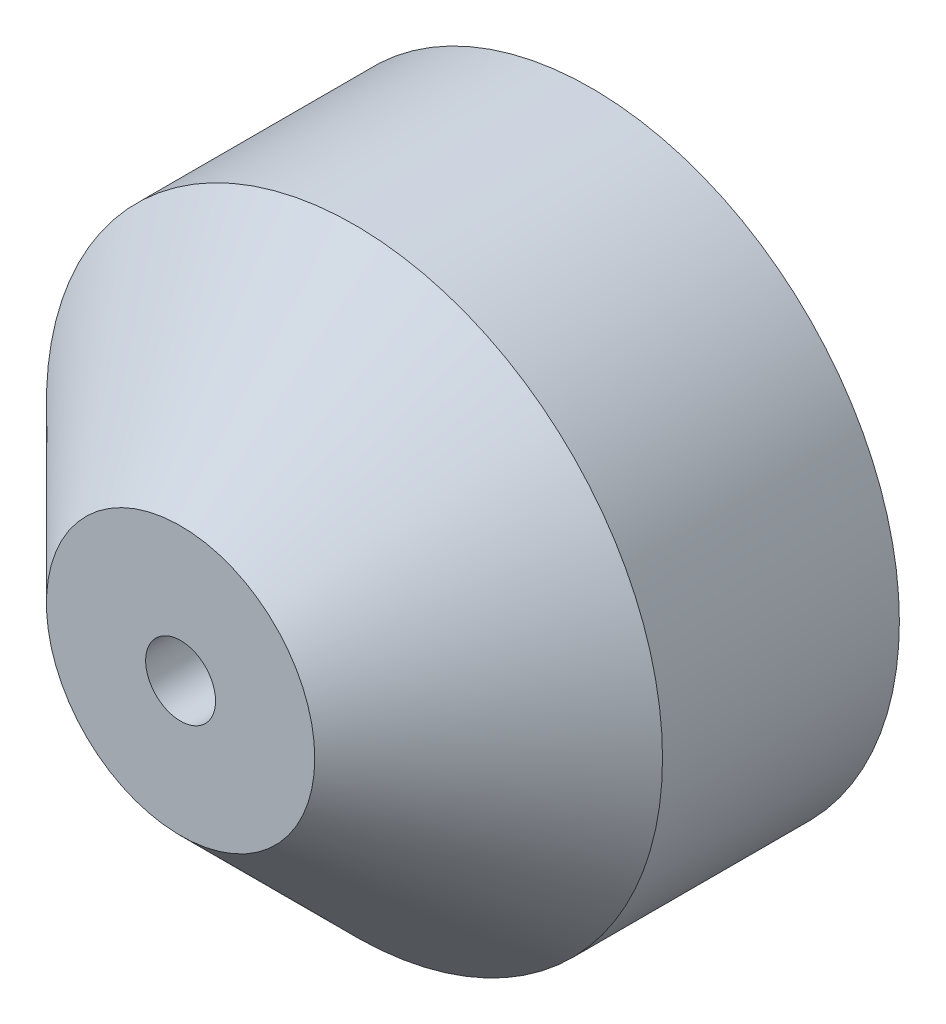
ISO-10303-21;
HEADER;
FILE_DESCRIPTION(('STEP AP214'),'2;1');
FILE_NAME('part.step','',(''),(''),'','','');
FILE_SCHEMA(('AUTOMOTIVE_DESIGN { 1 0 10303 214 1 1 1 1 }'));
ENDSEC;
DATA;
#1=APPLICATION_CONTEXT('core data for automotive mechanical design processes');
#2=APPLICATION_PROTOCOL_DEFINITION('international standard','automotive_design',2000,#1);
#3=PRODUCT_CONTEXT('',#1,'mechanical');
#4=PRODUCT('Part','Part','',(#3));
#5=PRODUCT_RELATED_PRODUCT_CATEGORY('part','',(#4));
#6=PRODUCT_DEFINITION_FORMATION('','',#4);
#7=PRODUCT_DEFINITION_CONTEXT('part definition',#1,'design');
#8=PRODUCT_DEFINITION('design','',#6,#7);
#9=PRODUCT_DEFINITION_SHAPE('','',#8);
#10=(LENGTH_UNIT() NAMED_UNIT(*) SI_UNIT(.MILLI.,.METRE.));
#11=(NAMED_UNIT(*) PLANE_ANGLE_UNIT() SI_UNIT($,.RADIAN.));
#12=(NAMED_UNIT(*) SI_UNIT($,.STERADIAN.) SOLID_ANGLE_UNIT());
#13=UNCERTAINTY_MEASURE_WITH_UNIT(LENGTH_MEASURE(1.E-05),#10,'distance_accuracy_value','');
#14=(GEOMETRIC_REPRESENTATION_CONTEXT(3) GLOBAL_UNCERTAINTY_ASSIGNED_CONTEXT((#13)) GLOBAL_UNIT_ASSIGNED_CONTEXT((#10,
#11,#12)) REPRESENTATION_CONTEXT('',''));
#15=CARTESIAN_POINT('',(0.,0.,0.));
#16=DIRECTION('',(0.,0.,1.));
#17=DIRECTION('',(1.,0.,0.));
#18=AXIS2_PLACEMENT_3D('',#15,#16,#17);
#19=CARTESIAN_POINT('',(0.,0.,-30.));
#20=DIRECTION('',(0.,0.,1.));
#21=DIRECTION('',(1.,0.,0.));
#22=AXIS2_PLACEMENT_3D('',#19,#20,#21);
#23=CYLINDRICAL_SURFACE('',#22,22.5);
#24=CARTESIAN_POINT('',(0.,0.,-12.7));
#25=DIRECTION('',(0.,0.,1.));
#26=DIRECTION('',(1.,0.,0.));
#27=AXIS2_PLACEMENT_3D('',#24,#25,#26);
#28=CIRCLE('',#27,22.5);
#29=CARTESIAN_POINT('',(22.5,0.,-12.7));
#30=VERTEX_POINT('',#29);
#31=EDGE_CURVE('E10',#30,#30,#28,.F.);
#32=ORIENTED_EDGE('',*,*,#31,.T.);
#33=EDGE_LOOP('',(#32));
#34=FACE_BOUND('',#33,.T.);
#35=CARTESIAN_POINT('',(0.,0.,-30.));
#36=DIRECTION('',(0.,0.,1.));
#37=DIRECTION('',(1.,0.,0.));
#38=AXIS2_PLACEMENT_3D('',#35,#36,#37);
#39=CIRCLE('',#38,22.5);
#40=CARTESIAN_POINT('',(22.5,0.,-30.));
#41=VERTEX_POINT('',#40);
#42=EDGE_CURVE('E49',#41,#41,#39,.T.);
#43=ORIENTED_EDGE('',*,*,#42,.T.);
#44=EDGE_LOOP('',(#43));
#45=FACE_BOUND('',#44,.T.);
#46=ADVANCED_FACE('F38',(#34,#45),#23,.T.);
#47=CARTESIAN_POINT('',(0.,0.,-30.));
#48=DIRECTION('',(0.,0.,1.));
#49=DIRECTION('',(1.,0.,0.));
#50=AXIS2_PLACEMENT_3D('',#47,#48,#49);
#51=PLANE('',#50);
#52=CARTESIAN_POINT('',(0.,0.,-30.));
#53=DIRECTION('',(0.,0.,-1.));
#54=DIRECTION('',(-1.,0.,0.));
#55=AXIS2_PLACEMENT_3D('',#52,#53,#54);
#56=CIRCLE('',#55,17.5);
#57=CARTESIAN_POINT('',(-17.5,0.,-30.));
#58=VERTEX_POINT('',#57);
#59=EDGE_CURVE('E56',#58,#58,#56,.T.);
#60=ORIENTED_EDGE('',*,*,#59,.F.);
#61=EDGE_LOOP('',(#60));
#62=FACE_BOUND('',#61,.T.);
#63=ORIENTED_EDGE('',*,*,#42,.F.);
#64=EDGE_LOOP('',(#63));
#65=FACE_BOUND('',#64,.T.);
#66=ADVANCED_FACE('F74',(#62,#65),#51,.F.);
#67=CARTESIAN_POINT('',(0.,0.,0.));
#68=DIRECTION('',(0.,0.,1.));
#69=DIRECTION('',(1.,0.,0.));
#70=AXIS2_PLACEMENT_3D('',#67,#68,#69);
#71=PLANE('',#70);
#72=CARTESIAN_POINT('',(0.,0.,0.));
#73=DIRECTION('',(0.,0.,1.));
#74=DIRECTION('',(1.,0.,0.));
#75=AXIS2_PLACEMENT_3D('',#72,#73,#74);
#76=CIRCLE('',#75,9.8);
#77=CARTESIAN_POINT('',(9.8,0.,0.));
#78=VERTEX_POINT('',#77);
#79=EDGE_CURVE('E45',#78,#78,#76,.T.);
#80=ORIENTED_EDGE('',*,*,#79,.T.);
#81=EDGE_LOOP('',(#80));
#82=FACE_BOUND('',#81,.T.);
#83=CARTESIAN_POINT('',(0.,0.,0.));
#84=DIRECTION('',(0.,0.,1.));
#85=DIRECTION('',(1.,0.,0.));
#86=AXIS2_PLACEMENT_3D('',#83,#84,#85);
#87=CIRCLE('',#86,2.55269999999999);
#88=CARTESIAN_POINT('',(2.55269999999999,0.,0.));
#89=VERTEX_POINT('',#88);
#90=EDGE_CURVE('E64',#89,#89,#87,.T.);
#91=ORIENTED_EDGE('',*,*,#90,.F.);
#92=EDGE_LOOP('',(#91));
#93=FACE_BOUND('',#92,.T.);
#94=ADVANCED_FACE('F71',(#82,#93),#71,.T.);
#95=CARTESIAN_POINT('',(0.,0.,-15.));
#96=DIRECTION('',(0.,0.,-1.));
#97=DIRECTION('',(-1.,0.,0.));
#98=AXIS2_PLACEMENT_3D('',#95,#96,#97);
#99=CYLINDRICAL_SURFACE('',#98,17.5);
#100=CARTESIAN_POINT('',(0.,0.,-15.));
#101=DIRECTION('',(0.,0.,-1.));
#102=DIRECTION('',(-1.,0.,0.));
#103=AXIS2_PLACEMENT_3D('',#100,#101,#102);
#104=CIRCLE('',#103,17.5);
#105=CARTESIAN_POINT('',(-17.5,0.,-15.));
#106=VERTEX_POINT('',#105);
#107=EDGE_CURVE('E53',#106,#106,#104,.T.);
#108=ORIENTED_EDGE('',*,*,#107,.F.);
#109=EDGE_LOOP('',(#108));
#110=FACE_BOUND('',#109,.T.);
#111=ORIENTED_EDGE('',*,*,#59,.T.);
#112=EDGE_LOOP('',(#111));
#113=FACE_BOUND('',#112,.T.);
#114=ADVANCED_FACE('F73',(#110,#113),#99,.F.);
#115=CARTESIAN_POINT('',(0.,0.,-15.));
#116=DIRECTION('',(0.,0.,-1.));
#117=DIRECTION('',(-1.,0.,0.));
#118=AXIS2_PLACEMENT_3D('',#115,#116,#117);
#119=PLANE('',#118);
#120=CARTESIAN_POINT('',(0.,0.,-15.));
#121=DIRECTION('',(0.,0.,-1.));
#122=DIRECTION('',(-1.,0.,0.));
#123=AXIS2_PLACEMENT_3D('',#120,#121,#122);
#124=CIRCLE('',#123,2.55269999999999);
#125=CARTESIAN_POINT('',(-2.55269999999999,0.,-15.));
#126=VERTEX_POINT('',#125);
#127=EDGE_CURVE('E59',#126,#126,#124,.T.);
#128=ORIENTED_EDGE('',*,*,#127,.F.);
#129=EDGE_LOOP('',(#128));
#130=FACE_BOUND('',#129,.T.);
#131=ORIENTED_EDGE('',*,*,#107,.T.);
#132=EDGE_LOOP('',(#131));
#133=FACE_BOUND('',#132,.T.);
#134=ADVANCED_FACE('F80',(#130,#133),#119,.T.);
#135=CARTESIAN_POINT('',(0.,0.,0.));
#136=DIRECTION('',(0.,0.,1.));
#137=DIRECTION('',(1.,0.,0.));
#138=AXIS2_PLACEMENT_3D('',#135,#136,#137);
#139=CYLINDRICAL_SURFACE('',#138,2.55269999999999);
#140=ORIENTED_EDGE('',*,*,#90,.T.);
#141=EDGE_LOOP('',(#140));
#142=FACE_BOUND('',#141,.T.);
#143=ORIENTED_EDGE('',*,*,#127,.T.);
#144=EDGE_LOOP('',(#143));
#145=FACE_BOUND('',#144,.T.);
#146=ADVANCED_FACE('F68',(#142,#145),#139,.F.);
#147=CARTESIAN_POINT('',(0.,0.,0.));
#148=DIRECTION('',(0.,0.,-1.));
#149=DIRECTION('',(-1.,0.,0.));
#150=AXIS2_PLACEMENT_3D('',#147,#148,#149);
#151=CONICAL_SURFACE('',#150,9.8,0.785398163397447);
#152=ORIENTED_EDGE('',*,*,#31,.F.);
#153=EDGE_LOOP('',(#152));
#154=FACE_BOUND('',#153,.T.);
#155=ORIENTED_EDGE('',*,*,#79,.F.);
#156=EDGE_LOOP('',(#155));
#157=FACE_BOUND('',#156,.T.);
#158=ADVANCED_FACE('F40',(#154,#157),#151,.T.);
#159=CLOSED_SHELL('',(#46,#66,#94,#114,#134,#146,#158));
#160=MANIFOLD_SOLID_BREP('B2',#159);
#161=ADVANCED_BREP_SHAPE_REPRESENTATION('',(#18,#160),#14);
#162=SHAPE_DEFINITION_REPRESENTATION(#9,#161);
ENDSEC;
END-ISO-10303-21;
